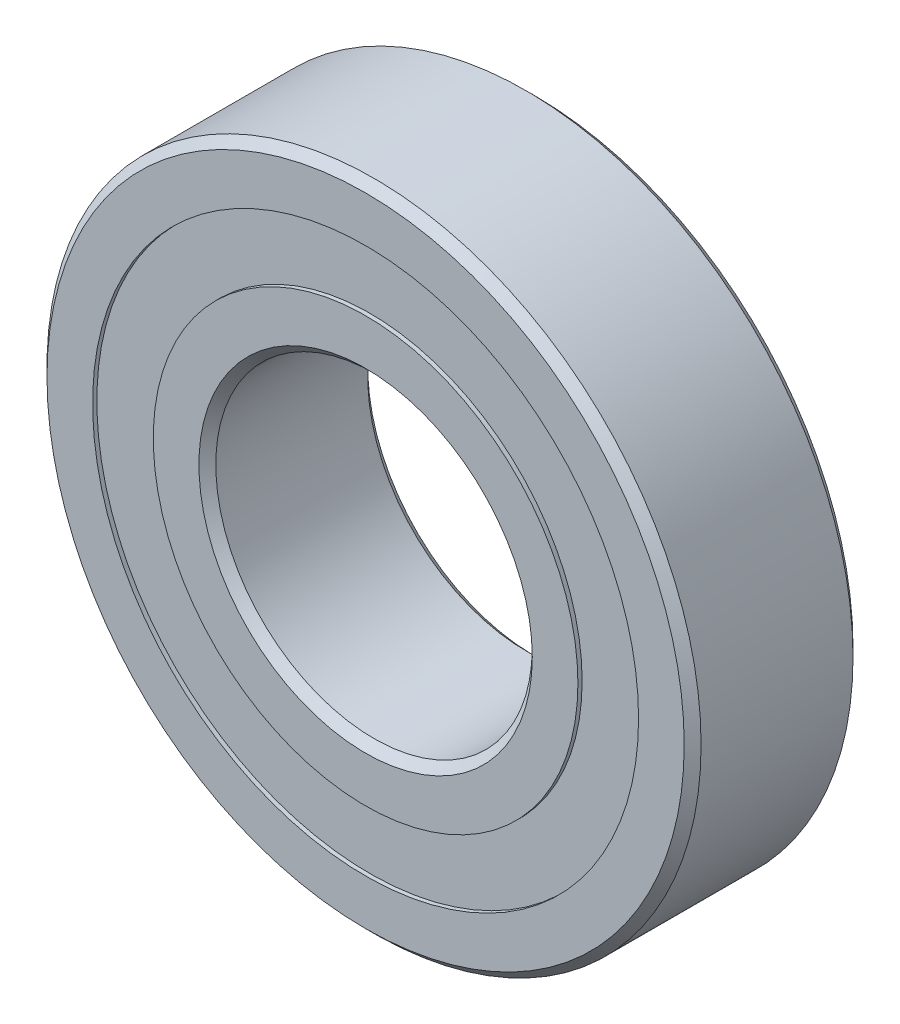
ISO-10303-21;
HEADER;
FILE_DESCRIPTION(('STEP AP214'),'2;1');
FILE_NAME('part.step','',(''),(''),'','','');
FILE_SCHEMA(('AUTOMOTIVE_DESIGN { 1 0 10303 214 1 1 1 1 }'));
ENDSEC;
DATA;
#1=APPLICATION_CONTEXT('core data for automotive mechanical design processes');
#2=APPLICATION_PROTOCOL_DEFINITION('international standard','automotive_design',2000,#1);
#3=PRODUCT_CONTEXT('',#1,'mechanical');
#4=PRODUCT('Part','Part','',(#3));
#5=PRODUCT_RELATED_PRODUCT_CATEGORY('part','',(#4));
#6=PRODUCT_DEFINITION_FORMATION('','',#4);
#7=PRODUCT_DEFINITION_CONTEXT('part definition',#1,'design');
#8=PRODUCT_DEFINITION('design','',#6,#7);
#9=PRODUCT_DEFINITION_SHAPE('','',#8);
#10=(LENGTH_UNIT() NAMED_UNIT(*) SI_UNIT(.MILLI.,.METRE.));
#11=(NAMED_UNIT(*) PLANE_ANGLE_UNIT() SI_UNIT($,.RADIAN.));
#12=(NAMED_UNIT(*) SI_UNIT($,.STERADIAN.) SOLID_ANGLE_UNIT());
#13=UNCERTAINTY_MEASURE_WITH_UNIT(LENGTH_MEASURE(1.E-05),#10,'distance_accuracy_value','');
#14=(GEOMETRIC_REPRESENTATION_CONTEXT(3) GLOBAL_UNCERTAINTY_ASSIGNED_CONTEXT((#13)) GLOBAL_UNIT_ASSIGNED_CONTEXT((#10,
#11,#12)) REPRESENTATION_CONTEXT('',''));
#15=CARTESIAN_POINT('',(0.,0.,0.));
#16=DIRECTION('',(0.,0.,1.));
#17=DIRECTION('',(1.,0.,0.));
#18=AXIS2_PLACEMENT_3D('',#15,#16,#17);
#19=CARTESIAN_POINT('',(0.,25.875,-7.6));
#20=DIRECTION('',(0.,0.,1.));
#21=DIRECTION('',(1.,0.,0.));
#22=AXIS2_PLACEMENT_3D('',#19,#20,#21);
#23=PLANE('',#22);
#24=CARTESIAN_POINT('',(0.,0.,-7.6));
#25=DIRECTION('',(0.,0.,1.));
#26=DIRECTION('',(1.,0.,0.));
#27=AXIS2_PLACEMENT_3D('',#24,#25,#26);
#28=CIRCLE('',#27,25.875);
#29=CARTESIAN_POINT('',(25.875,0.,-7.6));
#30=VERTEX_POINT('',#29);
#31=EDGE_CURVE('E63',#30,#30,#28,.T.);
#32=ORIENTED_EDGE('',*,*,#31,.F.);
#33=EDGE_LOOP('',(#32));
#34=FACE_BOUND('',#33,.T.);
#35=CARTESIAN_POINT('',(0.,0.,-7.6));
#36=DIRECTION('',(0.,0.,1.));
#37=DIRECTION('',(1.,0.,0.));
#38=AXIS2_PLACEMENT_3D('',#35,#36,#37);
#39=CIRCLE('',#38,20.125);
#40=CARTESIAN_POINT('',(20.125,0.,-7.6));
#41=VERTEX_POINT('',#40);
#42=EDGE_CURVE('E11',#41,#41,#39,.T.);
#43=ORIENTED_EDGE('',*,*,#42,.T.);
#44=EDGE_LOOP('',(#43));
#45=FACE_BOUND('',#44,.T.);
#46=ADVANCED_FACE('F49',(#34,#45),#23,.F.);
#47=CARTESIAN_POINT('',(0.,0.,8.));
#48=DIRECTION('',(0.,0.,1.));
#49=DIRECTION('',(1.,0.,0.));
#50=AXIS2_PLACEMENT_3D('',#47,#48,#49);
#51=CYLINDRICAL_SURFACE('',#50,20.125);
#52=ORIENTED_EDGE('',*,*,#42,.F.);
#53=EDGE_LOOP('',(#52));
#54=FACE_BOUND('',#53,.T.);
#55=CARTESIAN_POINT('',(0.,0.,-4.57248294787875));
#56=DIRECTION('',(0.,0.,1.));
#57=DIRECTION('',(1.,0.,0.));
#58=AXIS2_PLACEMENT_3D('',#55,#56,#57);
#59=CIRCLE('',#58,20.125);
#60=CARTESIAN_POINT('',(20.125,0.,-4.57248294787875));
#61=VERTEX_POINT('',#60);
#62=EDGE_CURVE('E55',#61,#61,#59,.T.);
#63=ORIENTED_EDGE('',*,*,#62,.T.);
#64=EDGE_LOOP('',(#63));
#65=FACE_BOUND('',#64,.T.);
#66=ADVANCED_FACE('F72',(#54,#65),#51,.F.);
#67=CARTESIAN_POINT('',(0.,25.875,-4.57248294787875));
#68=DIRECTION('',(0.,0.,-1.));
#69=DIRECTION('',(-1.,0.,0.));
#70=AXIS2_PLACEMENT_3D('',#67,#68,#69);
#71=PLANE('',#70);
#72=ORIENTED_EDGE('',*,*,#62,.F.);
#73=EDGE_LOOP('',(#72));
#74=FACE_BOUND('',#73,.T.);
#75=CARTESIAN_POINT('',(0.,0.,-4.57248294787875));
#76=DIRECTION('',(0.,0.,1.));
#77=DIRECTION('',(1.,0.,0.));
#78=AXIS2_PLACEMENT_3D('',#75,#76,#77);
#79=CIRCLE('',#78,25.875);
#80=CARTESIAN_POINT('',(25.875,0.,-4.57248294787875));
#81=VERTEX_POINT('',#80);
#82=EDGE_CURVE('E59',#81,#81,#79,.T.);
#83=ORIENTED_EDGE('',*,*,#82,.T.);
#84=EDGE_LOOP('',(#83));
#85=FACE_BOUND('',#84,.T.);
#86=ADVANCED_FACE('F76',(#74,#85),#71,.F.);
#87=CARTESIAN_POINT('',(0.,0.,8.));
#88=DIRECTION('',(0.,0.,1.));
#89=DIRECTION('',(1.,0.,0.));
#90=AXIS2_PLACEMENT_3D('',#87,#88,#89);
#91=CYLINDRICAL_SURFACE('',#90,25.875);
#92=ORIENTED_EDGE('',*,*,#82,.F.);
#93=EDGE_LOOP('',(#92));
#94=FACE_BOUND('',#93,.T.);
#95=ORIENTED_EDGE('',*,*,#31,.T.);
#96=EDGE_LOOP('',(#95));
#97=FACE_BOUND('',#96,.T.);
#98=ADVANCED_FACE('F69',(#94,#97),#91,.T.);
#99=CLOSED_SHELL('',(#46,#66,#86,#98));
#100=MANIFOLD_SOLID_BREP('B2',#99);
#101=CARTESIAN_POINT('',(0.,25.875,7.6));
#102=DIRECTION('',(0.,0.,-1.));
#103=DIRECTION('',(-1.,0.,0.));
#104=AXIS2_PLACEMENT_3D('',#101,#102,#103);
#105=PLANE('',#104);
#106=CARTESIAN_POINT('',(0.,0.,7.6));
#107=DIRECTION('',(0.,0.,1.));
#108=DIRECTION('',(1.,0.,0.));
#109=AXIS2_PLACEMENT_3D('',#106,#107,#108);
#110=CIRCLE('',#109,20.125);
#111=CARTESIAN_POINT('',(20.125,0.,7.6));
#112=VERTEX_POINT('',#111);
#113=EDGE_CURVE('E48',#112,#112,#110,.T.);
#114=ORIENTED_EDGE('',*,*,#113,.F.);
#115=EDGE_LOOP('',(#114));
#116=FACE_BOUND('',#115,.T.);
#117=CARTESIAN_POINT('',(0.,0.,7.6));
#118=DIRECTION('',(0.,0.,1.));
#119=DIRECTION('',(1.,0.,0.));
#120=AXIS2_PLACEMENT_3D('',#117,#118,#119);
#121=CIRCLE('',#120,25.875);
#122=CARTESIAN_POINT('',(25.875,0.,7.6));
#123=VERTEX_POINT('',#122);
#124=EDGE_CURVE('E130',#123,#123,#121,.T.);
#125=ORIENTED_EDGE('',*,*,#124,.T.);
#126=EDGE_LOOP('',(#125));
#127=FACE_BOUND('',#126,.T.);
#128=ADVANCED_FACE('F116',(#116,#127),#105,.F.);
#129=CARTESIAN_POINT('',(0.,0.,8.));
#130=DIRECTION('',(0.,0.,1.));
#131=DIRECTION('',(1.,0.,0.));
#132=AXIS2_PLACEMENT_3D('',#129,#130,#131);
#133=CYLINDRICAL_SURFACE('',#132,20.125);
#134=CARTESIAN_POINT('',(0.,0.,4.57248294787875));
#135=DIRECTION('',(0.,0.,1.));
#136=DIRECTION('',(1.,0.,0.));
#137=AXIS2_PLACEMENT_3D('',#134,#135,#136);
#138=CIRCLE('',#137,20.125);
#139=CARTESIAN_POINT('',(20.125,0.,4.57248294787875));
#140=VERTEX_POINT('',#139);
#141=EDGE_CURVE('E122',#140,#140,#138,.T.);
#142=ORIENTED_EDGE('',*,*,#141,.F.);
#143=EDGE_LOOP('',(#142));
#144=FACE_BOUND('',#143,.T.);
#145=ORIENTED_EDGE('',*,*,#113,.T.);
#146=EDGE_LOOP('',(#145));
#147=FACE_BOUND('',#146,.T.);
#148=ADVANCED_FACE('F145',(#144,#147),#133,.F.);
#149=CARTESIAN_POINT('',(0.,25.875,4.57248294787875));
#150=DIRECTION('',(0.,0.,1.));
#151=DIRECTION('',(1.,0.,0.));
#152=AXIS2_PLACEMENT_3D('',#149,#150,#151);
#153=PLANE('',#152);
#154=CARTESIAN_POINT('',(0.,0.,4.57248294787875));
#155=DIRECTION('',(0.,0.,1.));
#156=DIRECTION('',(1.,0.,0.));
#157=AXIS2_PLACEMENT_3D('',#154,#155,#156);
#158=CIRCLE('',#157,25.875);
#159=CARTESIAN_POINT('',(25.875,0.,4.57248294787875));
#160=VERTEX_POINT('',#159);
#161=EDGE_CURVE('E126',#160,#160,#158,.T.);
#162=ORIENTED_EDGE('',*,*,#161,.F.);
#163=EDGE_LOOP('',(#162));
#164=FACE_BOUND('',#163,.T.);
#165=ORIENTED_EDGE('',*,*,#141,.T.);
#166=EDGE_LOOP('',(#165));
#167=FACE_BOUND('',#166,.T.);
#168=ADVANCED_FACE('F140',(#164,#167),#153,.F.);
#169=CARTESIAN_POINT('',(0.,0.,8.));
#170=DIRECTION('',(0.,0.,1.));
#171=DIRECTION('',(1.,0.,0.));
#172=AXIS2_PLACEMENT_3D('',#169,#170,#171);
#173=CYLINDRICAL_SURFACE('',#172,25.875);
#174=ORIENTED_EDGE('',*,*,#124,.F.);
#175=EDGE_LOOP('',(#174));
#176=FACE_BOUND('',#175,.T.);
#177=ORIENTED_EDGE('',*,*,#161,.T.);
#178=EDGE_LOOP('',(#177));
#179=FACE_BOUND('',#178,.T.);
#180=ADVANCED_FACE('F137',(#176,#179),#173,.T.);
#181=CLOSED_SHELL('',(#128,#148,#168,#180));
#182=MANIFOLD_SOLID_BREP('B6',#181);
#183=CARTESIAN_POINT('',(-12.4347388014785,19.3488312551173,0.));
#184=DIRECTION('',(0.,0.,1.));
#185=DIRECTION('',(-0.540640817455586,0.841253532831188,0.));
#186=AXIS2_PLACEMENT_3D('',#183,#184,#185);
#187=SPHERICAL_SURFACE('',#186,4.57248294787875);
#188=CARTESIAN_POINT('',(-12.4347388014785,19.3488312551173,4.57248294787875));
#189=VERTEX_POINT('',#188);
#190=VERTEX_LOOP('',#189);
#191=FACE_BOUND('',#190,.T.);
#192=ADVANCED_FACE('F183',(#191),#187,.T.);
#193=CLOSED_SHELL('',(#192));
#194=MANIFOLD_SOLID_BREP('B43',#193);
#195=CARTESIAN_POINT('',(-20.9215358931538,9.55454529904364,0.));
#196=DIRECTION('',(0.,0.,1.));
#197=DIRECTION('',(-0.909631995354513,0.415415013001897,0.));
#198=AXIS2_PLACEMENT_3D('',#195,#196,#197);
#199=SPHERICAL_SURFACE('',#198,4.57248294787875);
#200=CARTESIAN_POINT('',(-20.9215358931538,9.55454529904364,4.57248294787875));
#201=VERTEX_POINT('',#200);
#202=VERTEX_LOOP('',#201);
#203=FACE_BOUND('',#202,.T.);
#204=ADVANCED_FACE('F203',(#203),#199,.T.);
#205=CLOSED_SHELL('',(#204));
#206=MANIFOLD_SOLID_BREP('B112',#205);
#207=CARTESIAN_POINT('',(-22.7658931632615,-3.27324128028532,0.));
#208=DIRECTION('',(0.,0.,1.));
#209=DIRECTION('',(-0.989821441880934,-0.142314838273275,0.));
#210=AXIS2_PLACEMENT_3D('',#207,#208,#209);
#211=SPHERICAL_SURFACE('',#210,4.57248294787875);
#212=CARTESIAN_POINT('',(-22.7658931632615,-3.27324128028532,4.57248294787875));
#213=VERTEX_POINT('',#212);
#214=VERTEX_LOOP('',#213);
#215=FACE_BOUND('',#214,.T.);
#216=ADVANCED_FACE('F223',(#215),#211,.T.);
#217=CLOSED_SHELL('',(#216));
#218=MANIFOLD_SOLID_BREP('B179',#217);
#219=CARTESIAN_POINT('',(-17.3822402101481,-15.0617968807414,0.));
#220=DIRECTION('',(0.,0.,1.));
#221=DIRECTION('',(-0.755749574354264,-0.654860733945278,0.));
#222=AXIS2_PLACEMENT_3D('',#219,#220,#221);
#223=SPHERICAL_SURFACE('',#222,4.57248294787875);
#224=CARTESIAN_POINT('',(-17.3822402101481,-15.0617968807414,4.57248294787875));
#225=VERTEX_POINT('',#224);
#226=VERTEX_LOOP('',#225);
#227=FACE_BOUND('',#226,.T.);
#228=ADVANCED_FACE('F243',(#227),#223,.T.);
#229=CLOSED_SHELL('',(#228));
#230=MANIFOLD_SOLID_BREP('B199',#229);
#231=CARTESIAN_POINT('',(-6.47984880735305,-22.0683383931334,0.));
#232=DIRECTION('',(0.,0.,1.));
#233=DIRECTION('',(-0.281732556841437,-0.959492973614495,0.));
#234=AXIS2_PLACEMENT_3D('',#231,#232,#233);
#235=SPHERICAL_SURFACE('',#234,4.57248294787875);
#236=CARTESIAN_POINT('',(-6.47984880735305,-22.0683383931334,4.57248294787875));
#237=VERTEX_POINT('',#236);
#238=VERTEX_LOOP('',#237);
#239=FACE_BOUND('',#238,.T.);
#240=ADVANCED_FACE('F263',(#239),#235,.T.);
#241=CLOSED_SHELL('',(#240));
#242=MANIFOLD_SOLID_BREP('B219',#241);
#243=CARTESIAN_POINT('',(6.47984880735274,-22.0683383931335,0.));
#244=DIRECTION('',(0.,0.,1.));
#245=DIRECTION('',(0.281732556841423,-0.959492973614499,0.));
#246=AXIS2_PLACEMENT_3D('',#243,#244,#245);
#247=SPHERICAL_SURFACE('',#246,4.57248294787875);
#248=CARTESIAN_POINT('',(6.47984880735274,-22.0683383931335,4.57248294787875));
#249=VERTEX_POINT('',#248);
#250=VERTEX_LOOP('',#249);
#251=FACE_BOUND('',#250,.T.);
#252=ADVANCED_FACE('F283',(#251),#247,.T.);
#253=CLOSED_SHELL('',(#252));
#254=MANIFOLD_SOLID_BREP('B239',#253);
#255=CARTESIAN_POINT('',(17.3822402101479,-15.0617968807416,0.));
#256=DIRECTION('',(0.,0.,1.));
#257=DIRECTION('',(0.755749574354255,-0.654860733945289,0.));
#258=AXIS2_PLACEMENT_3D('',#255,#256,#257);
#259=SPHERICAL_SURFACE('',#258,4.57248294787875);
#260=CARTESIAN_POINT('',(17.3822402101479,-15.0617968807416,4.57248294787875));
#261=VERTEX_POINT('',#260);
#262=VERTEX_LOOP('',#261);
#263=FACE_BOUND('',#262,.T.);
#264=ADVANCED_FACE('F303',(#263),#259,.T.);
#265=CLOSED_SHELL('',(#264));
#266=MANIFOLD_SOLID_BREP('B259',#265);
#267=CARTESIAN_POINT('',(22.7658931632614,-3.27324128028565,0.));
#268=DIRECTION('',(0.,0.,1.));
#269=DIRECTION('',(0.989821441880932,-0.142314838273289,0.));
#270=AXIS2_PLACEMENT_3D('',#267,#268,#269);
#271=SPHERICAL_SURFACE('',#270,4.57248294787875);
#272=CARTESIAN_POINT('',(22.7658931632614,-3.27324128028565,4.57248294787875));
#273=VERTEX_POINT('',#272);
#274=VERTEX_LOOP('',#273);
#275=FACE_BOUND('',#274,.T.);
#276=ADVANCED_FACE('F323',(#275),#271,.T.);
#277=CLOSED_SHELL('',(#276));
#278=MANIFOLD_SOLID_BREP('B279',#277);
#279=CARTESIAN_POINT('',(20.9215358931539,9.55454529904333,0.));
#280=DIRECTION('',(0.,0.,1.));
#281=DIRECTION('',(0.909631995354519,0.415415013001884,0.));
#282=AXIS2_PLACEMENT_3D('',#279,#280,#281);
#283=SPHERICAL_SURFACE('',#282,4.57248294787875);
#284=CARTESIAN_POINT('',(20.9215358931539,9.55454529904333,4.57248294787875));
#285=VERTEX_POINT('',#284);
#286=VERTEX_LOOP('',#285);
#287=FACE_BOUND('',#286,.T.);
#288=ADVANCED_FACE('F343',(#287),#283,.T.);
#289=CLOSED_SHELL('',(#288));
#290=MANIFOLD_SOLID_BREP('B299',#289);
#291=CARTESIAN_POINT('',(12.4347388014788,19.3488312551172,0.));
#292=DIRECTION('',(0.,0.,1.));
#293=DIRECTION('',(0.540640817455599,0.841253532831181,0.));
#294=AXIS2_PLACEMENT_3D('',#291,#292,#293);
#295=SPHERICAL_SURFACE('',#294,4.57248294787875);
#296=CARTESIAN_POINT('',(12.4347388014788,19.3488312551172,4.57248294787875));
#297=VERTEX_POINT('',#296);
#298=VERTEX_LOOP('',#297);
#299=FACE_BOUND('',#298,.T.);
#300=ADVANCED_FACE('F363',(#299),#295,.T.);
#301=CLOSED_SHELL('',(#300));
#302=MANIFOLD_SOLID_BREP('B319',#301);
#303=CARTESIAN_POINT('',(0.,23.,0.));
#304=DIRECTION('',(0.,0.,1.));
#305=DIRECTION('',(0.,1.,0.));
#306=AXIS2_PLACEMENT_3D('',#303,#304,#305);
#307=SPHERICAL_SURFACE('',#306,4.57248294787875);
#308=CARTESIAN_POINT('',(0.,23.,4.57248294787875));
#309=VERTEX_POINT('',#308);
#310=VERTEX_LOOP('',#309);
#311=FACE_BOUND('',#310,.T.);
#312=ADVANCED_FACE('F385',(#311),#307,.T.);
#313=CLOSED_SHELL('',(#312));
#314=MANIFOLD_SOLID_BREP('B339',#313);
#315=CARTESIAN_POINT('',(0.,0.,8.));
#316=DIRECTION('',(0.,0.,1.));
#317=DIRECTION('',(1.,0.,0.));
#318=AXIS2_PLACEMENT_3D('',#315,#316,#317);
#319=CONICAL_SURFACE('',#318,15.8,0.785398163397449);
#320=CARTESIAN_POINT('',(0.,0.,7.2));
#321=DIRECTION('',(0.,0.,1.));
#322=DIRECTION('',(1.,0.,0.));
#323=AXIS2_PLACEMENT_3D('',#320,#321,#322);
#324=CIRCLE('',#323,15.);
#325=CARTESIAN_POINT('',(15.,0.,7.2));
#326=VERTEX_POINT('',#325);
#327=EDGE_CURVE('E384',#326,#326,#324,.T.);
#328=ORIENTED_EDGE('',*,*,#327,.F.);
#329=EDGE_LOOP('',(#328));
#330=FACE_BOUND('',#329,.T.);
#331=CARTESIAN_POINT('',(0.,0.,8.));
#332=DIRECTION('',(0.,0.,1.));
#333=DIRECTION('',(1.,0.,0.));
#334=AXIS2_PLACEMENT_3D('',#331,#332,#333);
#335=CIRCLE('',#334,15.8);
#336=CARTESIAN_POINT('',(15.8,0.,8.));
#337=VERTEX_POINT('',#336);
#338=EDGE_CURVE('E432',#337,#337,#335,.T.);
#339=ORIENTED_EDGE('',*,*,#338,.T.);
#340=EDGE_LOOP('',(#339));
#341=FACE_BOUND('',#340,.T.);
#342=ADVANCED_FACE('F404',(#330,#341),#319,.F.);
#343=CARTESIAN_POINT('',(0.,0.,8.));
#344=DIRECTION('',(0.,0.,1.));
#345=DIRECTION('',(1.,0.,0.));
#346=AXIS2_PLACEMENT_3D('',#343,#344,#345);
#347=CYLINDRICAL_SURFACE('',#346,15.);
#348=CARTESIAN_POINT('',(0.,0.,-7.2));
#349=DIRECTION('',(0.,0.,1.));
#350=DIRECTION('',(1.,0.,0.));
#351=AXIS2_PLACEMENT_3D('',#348,#349,#350);
#352=CIRCLE('',#351,15.);
#353=CARTESIAN_POINT('',(15.,0.,-7.2));
#354=VERTEX_POINT('',#353);
#355=EDGE_CURVE('E410',#354,#354,#352,.T.);
#356=ORIENTED_EDGE('',*,*,#355,.F.);
#357=EDGE_LOOP('',(#356));
#358=FACE_BOUND('',#357,.T.);
#359=ORIENTED_EDGE('',*,*,#327,.T.);
#360=EDGE_LOOP('',(#359));
#361=FACE_BOUND('',#360,.T.);
#362=ADVANCED_FACE('F469',(#358,#361),#347,.F.);
#363=CARTESIAN_POINT('',(0.,0.,-7.2));
#364=DIRECTION('',(0.,0.,-1.));
#365=DIRECTION('',(-1.,0.,0.));
#366=AXIS2_PLACEMENT_3D('',#363,#364,#365);
#367=CONICAL_SURFACE('',#366,15.,0.785398163397448);
#368=CARTESIAN_POINT('',(0.,0.,-8.));
#369=DIRECTION('',(0.,0.,1.));
#370=DIRECTION('',(1.,0.,0.));
#371=AXIS2_PLACEMENT_3D('',#368,#369,#370);
#372=CIRCLE('',#371,15.8);
#373=CARTESIAN_POINT('',(15.8,0.,-8.));
#374=VERTEX_POINT('',#373);
#375=EDGE_CURVE('E414',#374,#374,#372,.T.);
#376=ORIENTED_EDGE('',*,*,#375,.F.);
#377=EDGE_LOOP('',(#376));
#378=FACE_BOUND('',#377,.T.);
#379=ORIENTED_EDGE('',*,*,#355,.T.);
#380=EDGE_LOOP('',(#379));
#381=FACE_BOUND('',#380,.T.);
#382=ADVANCED_FACE('F464',(#378,#381),#367,.F.);
#383=CARTESIAN_POINT('',(0.,15.8,-8.));
#384=DIRECTION('',(0.,0.,1.));
#385=DIRECTION('',(1.,0.,0.));
#386=AXIS2_PLACEMENT_3D('',#383,#384,#385);
#387=PLANE('',#386);
#388=CARTESIAN_POINT('',(0.,0.,-8.));
#389=DIRECTION('',(0.,0.,1.));
#390=DIRECTION('',(1.,0.,0.));
#391=AXIS2_PLACEMENT_3D('',#388,#389,#390);
#392=CIRCLE('',#391,20.125);
#393=CARTESIAN_POINT('',(20.125,0.,-8.));
#394=VERTEX_POINT('',#393);
#395=EDGE_CURVE('E418',#394,#394,#392,.T.);
#396=ORIENTED_EDGE('',*,*,#395,.F.);
#397=EDGE_LOOP('',(#396));
#398=FACE_BOUND('',#397,.T.);
#399=ORIENTED_EDGE('',*,*,#375,.T.);
#400=EDGE_LOOP('',(#399));
#401=FACE_BOUND('',#400,.T.);
#402=ADVANCED_FACE('F458',(#398,#401),#387,.F.);
#403=CARTESIAN_POINT('',(0.,0.,8.));
#404=DIRECTION('',(0.,0.,1.));
#405=DIRECTION('',(1.,0.,0.));
#406=AXIS2_PLACEMENT_3D('',#403,#404,#405);
#407=CYLINDRICAL_SURFACE('',#406,20.125);
#408=CARTESIAN_POINT('',(0.,0.,-3.55555555555555));
#409=DIRECTION('',(0.,0.,1.));
#410=DIRECTION('',(1.,0.,0.));
#411=AXIS2_PLACEMENT_3D('',#408,#409,#410);
#412=CIRCLE('',#411,20.125);
#413=CARTESIAN_POINT('',(20.125,0.,-3.55555555555555));
#414=VERTEX_POINT('',#413);
#415=EDGE_CURVE('E423',#414,#414,#412,.T.);
#416=ORIENTED_EDGE('',*,*,#415,.F.);
#417=EDGE_LOOP('',(#416));
#418=FACE_BOUND('',#417,.T.);
#419=ORIENTED_EDGE('',*,*,#395,.T.);
#420=EDGE_LOOP('',(#419));
#421=FACE_BOUND('',#420,.T.);
#422=ADVANCED_FACE('F452',(#418,#421),#407,.T.);
#423=CARTESIAN_POINT('',(0.,0.,0.));
#424=DIRECTION('',(0.,0.,1.));
#425=DIRECTION('',(1.,0.,0.));
#426=AXIS2_PLACEMENT_3D('',#423,#424,#425);
#427=TOROIDAL_SURFACE('',#426,23.,4.57248294787875);
#428=CARTESIAN_POINT('',(0.,0.,3.55555555555556));
#429=DIRECTION('',(0.,0.,1.));
#430=DIRECTION('',(1.,0.,0.));
#431=AXIS2_PLACEMENT_3D('',#428,#429,#430);
#432=CIRCLE('',#431,20.125);
#433=CARTESIAN_POINT('',(20.125,0.,3.55555555555556));
#434=VERTEX_POINT('',#433);
#435=EDGE_CURVE('E426',#434,#434,#432,.T.);
#436=ORIENTED_EDGE('',*,*,#435,.F.);
#437=EDGE_LOOP('',(#436));
#438=FACE_BOUND('',#437,.T.);
#439=ORIENTED_EDGE('',*,*,#415,.T.);
#440=EDGE_LOOP('',(#439));
#441=FACE_BOUND('',#440,.T.);
#442=ADVANCED_FACE('F446',(#438,#441),#427,.F.);
#443=CARTESIAN_POINT('',(0.,0.,8.));
#444=DIRECTION('',(0.,0.,1.));
#445=DIRECTION('',(1.,0.,0.));
#446=AXIS2_PLACEMENT_3D('',#443,#444,#445);
#447=CYLINDRICAL_SURFACE('',#446,20.125);
#448=CARTESIAN_POINT('',(0.,0.,8.));
#449=DIRECTION('',(0.,0.,1.));
#450=DIRECTION('',(1.,0.,0.));
#451=AXIS2_PLACEMENT_3D('',#448,#449,#450);
#452=CIRCLE('',#451,20.125);
#453=CARTESIAN_POINT('',(20.125,0.,8.));
#454=VERTEX_POINT('',#453);
#455=EDGE_CURVE('E429',#454,#454,#452,.T.);
#456=ORIENTED_EDGE('',*,*,#455,.F.);
#457=EDGE_LOOP('',(#456));
#458=FACE_BOUND('',#457,.T.);
#459=ORIENTED_EDGE('',*,*,#435,.T.);
#460=EDGE_LOOP('',(#459));
#461=FACE_BOUND('',#460,.T.);
#462=ADVANCED_FACE('F440',(#458,#461),#447,.T.);
#463=CARTESIAN_POINT('',(0.,15.8,8.));
#464=DIRECTION('',(0.,0.,-1.));
#465=DIRECTION('',(-1.,0.,0.));
#466=AXIS2_PLACEMENT_3D('',#463,#464,#465);
#467=PLANE('',#466);
#468=ORIENTED_EDGE('',*,*,#338,.F.);
#469=EDGE_LOOP('',(#468));
#470=FACE_BOUND('',#469,.T.);
#471=ORIENTED_EDGE('',*,*,#455,.T.);
#472=EDGE_LOOP('',(#471));
#473=FACE_BOUND('',#472,.T.);
#474=ADVANCED_FACE('F437',(#470,#473),#467,.F.);
#475=CLOSED_SHELL('',(#342,#362,#382,#402,#422,#442,#462,#474));
#476=MANIFOLD_SOLID_BREP('B359',#475);
#477=CARTESIAN_POINT('',(0.,0.,7.2));
#478=DIRECTION('',(0.,0.,-1.));
#479=DIRECTION('',(-1.,0.,0.));
#480=AXIS2_PLACEMENT_3D('',#477,#478,#479);
#481=CONICAL_SURFACE('',#480,31.,0.78539816339745);
#482=CARTESIAN_POINT('',(0.,0.,8.));
#483=DIRECTION('',(0.,0.,1.));
#484=DIRECTION('',(1.,0.,0.));
#485=AXIS2_PLACEMENT_3D('',#482,#483,#484);
#486=CIRCLE('',#485,30.2);
#487=CARTESIAN_POINT('',(30.2,0.,8.));
#488=VERTEX_POINT('',#487);
#489=EDGE_CURVE('E403',#488,#488,#486,.T.);
#490=ORIENTED_EDGE('',*,*,#489,.F.);
#491=EDGE_LOOP('',(#490));
#492=FACE_BOUND('',#491,.T.);
#493=CARTESIAN_POINT('',(0.,0.,7.2));
#494=DIRECTION('',(0.,0.,1.));
#495=DIRECTION('',(1.,0.,0.));
#496=AXIS2_PLACEMENT_3D('',#493,#494,#495);
#497=CIRCLE('',#496,31.);
#498=CARTESIAN_POINT('',(31.,0.,7.2));
#499=VERTEX_POINT('',#498);
#500=EDGE_CURVE('E561',#499,#499,#497,.T.);
#501=ORIENTED_EDGE('',*,*,#500,.T.);
#502=EDGE_LOOP('',(#501));
#503=FACE_BOUND('',#502,.T.);
#504=ADVANCED_FACE('F526',(#492,#503),#481,.T.);
#505=CARTESIAN_POINT('',(0.,30.2,8.));
#506=DIRECTION('',(0.,0.,-1.));
#507=DIRECTION('',(-1.,0.,0.));
#508=AXIS2_PLACEMENT_3D('',#505,#506,#507);
#509=PLANE('',#508);
#510=CARTESIAN_POINT('',(0.,0.,8.));
#511=DIRECTION('',(0.,0.,1.));
#512=DIRECTION('',(1.,0.,0.));
#513=AXIS2_PLACEMENT_3D('',#510,#511,#512);
#514=CIRCLE('',#513,25.875);
#515=CARTESIAN_POINT('',(25.875,0.,8.));
#516=VERTEX_POINT('',#515);
#517=EDGE_CURVE('E533',#516,#516,#514,.T.);
#518=ORIENTED_EDGE('',*,*,#517,.F.);
#519=EDGE_LOOP('',(#518));
#520=FACE_BOUND('',#519,.T.);
#521=ORIENTED_EDGE('',*,*,#489,.T.);
#522=EDGE_LOOP('',(#521));
#523=FACE_BOUND('',#522,.T.);
#524=ADVANCED_FACE('F599',(#520,#523),#509,.F.);
#525=CARTESIAN_POINT('',(0.,0.,8.));
#526=DIRECTION('',(0.,0.,1.));
#527=DIRECTION('',(1.,0.,0.));
#528=AXIS2_PLACEMENT_3D('',#525,#526,#527);
#529=CYLINDRICAL_SURFACE('',#528,25.875);
#530=CARTESIAN_POINT('',(0.,0.,3.55555555555555));
#531=DIRECTION('',(0.,0.,1.));
#532=DIRECTION('',(1.,0.,0.));
#533=AXIS2_PLACEMENT_3D('',#530,#531,#532);
#534=CIRCLE('',#533,25.875);
#535=CARTESIAN_POINT('',(25.875,0.,3.55555555555555));
#536=VERTEX_POINT('',#535);
#537=EDGE_CURVE('E538',#536,#536,#534,.T.);
#538=ORIENTED_EDGE('',*,*,#537,.F.);
#539=EDGE_LOOP('',(#538));
#540=FACE_BOUND('',#539,.T.);
#541=ORIENTED_EDGE('',*,*,#517,.T.);
#542=EDGE_LOOP('',(#541));
#543=FACE_BOUND('',#542,.T.);
#544=ADVANCED_FACE('F594',(#540,#543),#529,.F.);
#545=CARTESIAN_POINT('',(0.,0.,0.));
#546=DIRECTION('',(0.,0.,1.));
#547=DIRECTION('',(1.,0.,0.));
#548=AXIS2_PLACEMENT_3D('',#545,#546,#547);
#549=TOROIDAL_SURFACE('',#548,23.,4.57248294787875);
#550=CARTESIAN_POINT('',(0.,0.,-3.55555555555555));
#551=DIRECTION('',(0.,0.,1.));
#552=DIRECTION('',(1.,0.,0.));
#553=AXIS2_PLACEMENT_3D('',#550,#551,#552);
#554=CIRCLE('',#553,25.875);
#555=CARTESIAN_POINT('',(25.875,0.,-3.55555555555555));
#556=VERTEX_POINT('',#555);
#557=EDGE_CURVE('E543',#556,#556,#554,.T.);
#558=ORIENTED_EDGE('',*,*,#557,.F.);
#559=EDGE_LOOP('',(#558));
#560=FACE_BOUND('',#559,.T.);
#561=ORIENTED_EDGE('',*,*,#537,.T.);
#562=EDGE_LOOP('',(#561));
#563=FACE_BOUND('',#562,.T.);
#564=ADVANCED_FACE('F588',(#560,#563),#549,.F.);
#565=CARTESIAN_POINT('',(0.,0.,8.));
#566=DIRECTION('',(0.,0.,1.));
#567=DIRECTION('',(1.,0.,0.));
#568=AXIS2_PLACEMENT_3D('',#565,#566,#567);
#569=CYLINDRICAL_SURFACE('',#568,25.875);
#570=CARTESIAN_POINT('',(0.,0.,-8.));
#571=DIRECTION('',(0.,0.,1.));
#572=DIRECTION('',(1.,0.,0.));
#573=AXIS2_PLACEMENT_3D('',#570,#571,#572);
#574=CIRCLE('',#573,25.875);
#575=CARTESIAN_POINT('',(25.875,0.,-8.));
#576=VERTEX_POINT('',#575);
#577=EDGE_CURVE('E549',#576,#576,#574,.T.);
#578=ORIENTED_EDGE('',*,*,#577,.F.);
#579=EDGE_LOOP('',(#578));
#580=FACE_BOUND('',#579,.T.);
#581=ORIENTED_EDGE('',*,*,#557,.T.);
#582=EDGE_LOOP('',(#581));
#583=FACE_BOUND('',#582,.T.);
#584=ADVANCED_FACE('F582',(#580,#583),#569,.F.);
#585=CARTESIAN_POINT('',(0.,30.2,-8.));
#586=DIRECTION('',(0.,0.,1.));
#587=DIRECTION('',(1.,0.,0.));
#588=AXIS2_PLACEMENT_3D('',#585,#586,#587);
#589=PLANE('',#588);
#590=CARTESIAN_POINT('',(0.,0.,-8.));
#591=DIRECTION('',(0.,0.,1.));
#592=DIRECTION('',(1.,0.,0.));
#593=AXIS2_PLACEMENT_3D('',#590,#591,#592);
#594=CIRCLE('',#593,30.2);
#595=CARTESIAN_POINT('',(30.2,0.,-8.));
#596=VERTEX_POINT('',#595);
#597=EDGE_CURVE('E553',#596,#596,#594,.T.);
#598=ORIENTED_EDGE('',*,*,#597,.F.);
#599=EDGE_LOOP('',(#598));
#600=FACE_BOUND('',#599,.T.);
#601=ORIENTED_EDGE('',*,*,#577,.T.);
#602=EDGE_LOOP('',(#601));
#603=FACE_BOUND('',#602,.T.);
#604=ADVANCED_FACE('F576',(#600,#603),#589,.F.);
#605=CARTESIAN_POINT('',(0.,0.,-8.));
#606=DIRECTION('',(0.,0.,1.));
#607=DIRECTION('',(1.,0.,0.));
#608=AXIS2_PLACEMENT_3D('',#605,#606,#607);
#609=CONICAL_SURFACE('',#608,30.2,0.785398163397448);
#610=CARTESIAN_POINT('',(0.,0.,-7.2));
#611=DIRECTION('',(0.,0.,1.));
#612=DIRECTION('',(1.,0.,0.));
#613=AXIS2_PLACEMENT_3D('',#610,#611,#612);
#614=CIRCLE('',#613,31.);
#615=CARTESIAN_POINT('',(31.,0.,-7.2));
#616=VERTEX_POINT('',#615);
#617=EDGE_CURVE('E557',#616,#616,#614,.T.);
#618=ORIENTED_EDGE('',*,*,#617,.F.);
#619=EDGE_LOOP('',(#618));
#620=FACE_BOUND('',#619,.T.);
#621=ORIENTED_EDGE('',*,*,#597,.T.);
#622=EDGE_LOOP('',(#621));
#623=FACE_BOUND('',#622,.T.);
#624=ADVANCED_FACE('F570',(#620,#623),#609,.T.);
#625=CARTESIAN_POINT('',(0.,0.,8.));
#626=DIRECTION('',(0.,0.,1.));
#627=DIRECTION('',(1.,0.,0.));
#628=AXIS2_PLACEMENT_3D('',#625,#626,#627);
#629=CYLINDRICAL_SURFACE('',#628,31.);
#630=ORIENTED_EDGE('',*,*,#500,.F.);
#631=EDGE_LOOP('',(#630));
#632=FACE_BOUND('',#631,.T.);
#633=ORIENTED_EDGE('',*,*,#617,.T.);
#634=EDGE_LOOP('',(#633));
#635=FACE_BOUND('',#634,.T.);
#636=ADVANCED_FACE('F567',(#632,#635),#629,.T.);
#637=CLOSED_SHELL('',(#504,#524,#544,#564,#584,#604,#624,#636));
#638=MANIFOLD_SOLID_BREP('B379',#637);
#639=ADVANCED_BREP_SHAPE_REPRESENTATION('',(#18,#100,#182,#194,#206,#218,#230,#242,#254,#266,
#278,#290,#302,#314,#476,#638),#14);
#640=SHAPE_DEFINITION_REPRESENTATION(#9,#639);
ENDSEC;
END-ISO-10303-21;
